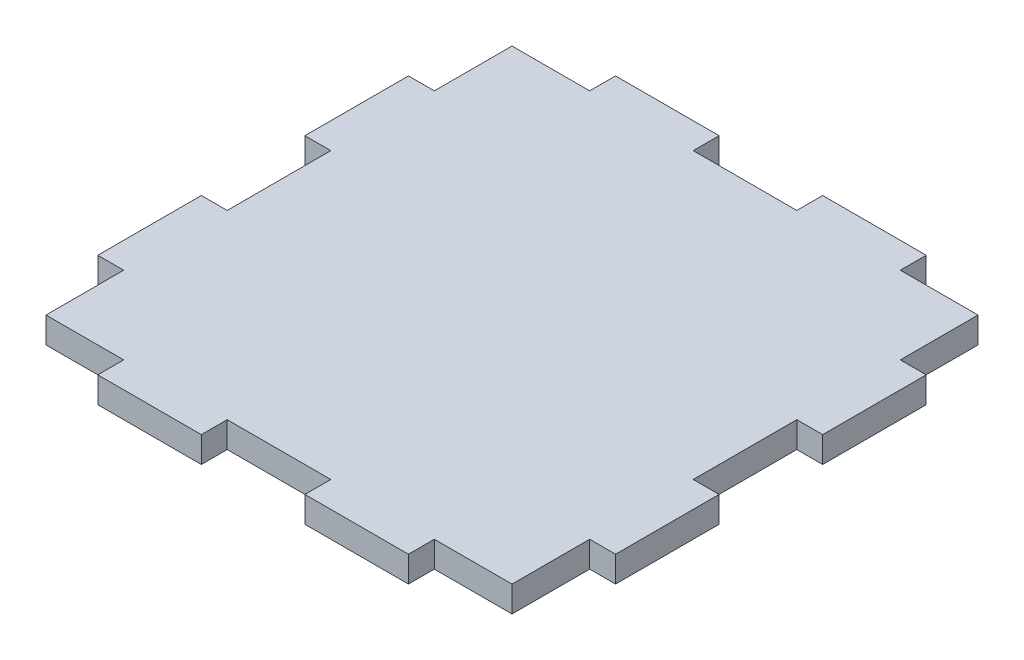
ISO-10303-21;
HEADER;
FILE_DESCRIPTION(('STEP AP214'),'2;1');
FILE_NAME('part.step','',(''),(''),'','','');
FILE_SCHEMA(('AUTOMOTIVE_DESIGN { 1 0 10303 214 1 1 1 1 }'));
ENDSEC;
DATA;
#1=APPLICATION_CONTEXT('core data for automotive mechanical design processes');
#2=APPLICATION_PROTOCOL_DEFINITION('international standard','automotive_design',2000,#1);
#3=PRODUCT_CONTEXT('',#1,'mechanical');
#4=PRODUCT('Part','Part','',(#3));
#5=PRODUCT_RELATED_PRODUCT_CATEGORY('part','',(#4));
#6=PRODUCT_DEFINITION_FORMATION('','',#4);
#7=PRODUCT_DEFINITION_CONTEXT('part definition',#1,'design');
#8=PRODUCT_DEFINITION('design','',#6,#7);
#9=PRODUCT_DEFINITION_SHAPE('','',#8);
#10=(LENGTH_UNIT() NAMED_UNIT(*) SI_UNIT(.MILLI.,.METRE.));
#11=(NAMED_UNIT(*) PLANE_ANGLE_UNIT() SI_UNIT($,.RADIAN.));
#12=(NAMED_UNIT(*) SI_UNIT($,.STERADIAN.) SOLID_ANGLE_UNIT());
#13=UNCERTAINTY_MEASURE_WITH_UNIT(LENGTH_MEASURE(1.E-05),#10,'distance_accuracy_value','');
#14=(GEOMETRIC_REPRESENTATION_CONTEXT(3) GLOBAL_UNCERTAINTY_ASSIGNED_CONTEXT((#13)) GLOBAL_UNIT_ASSIGNED_CONTEXT((#10,
#11,#12)) REPRESENTATION_CONTEXT('',''));
#15=CARTESIAN_POINT('',(0.,0.,0.));
#16=DIRECTION('',(0.,0.,1.));
#17=DIRECTION('',(1.,0.,0.));
#18=AXIS2_PLACEMENT_3D('',#15,#16,#17);
#19=CARTESIAN_POINT('',(-186.27216066482,9.525,3.17867036011081));
#20=DIRECTION('',(0.,0.,-1.));
#21=DIRECTION('',(-1.,0.,0.));
#22=AXIS2_PLACEMENT_3D('',#19,#20,#21);
#23=PLANE('',#22);
#24=DIRECTION('',(1.,0.,0.));
#25=VECTOR('',#24,1.);
#26=CARTESIAN_POINT('',(-186.27216066482,0.,3.17867036011081));
#27=LINE('',#26,#25);
#28=CARTESIAN_POINT('',(-148.17216066482,0.,3.17867036011081));
#29=VERTEX_POINT('',#28);
#30=CARTESIAN_POINT('',(-110.07216066482,0.,3.17867036011081));
#31=VERTEX_POINT('',#30);
#32=EDGE_CURVE('E631',#29,#31,#27,.T.);
#33=ORIENTED_EDGE('',*,*,#32,.T.);
#34=DIRECTION('',(0.,-1.,0.));
#35=VECTOR('',#34,1.);
#36=CARTESIAN_POINT('',(-110.07216066482,9.525,3.17867036011081));
#37=LINE('',#36,#35);
#38=CARTESIAN_POINT('',(-110.07216066482,9.525,3.17867036011081));
#39=VERTEX_POINT('',#38);
#40=EDGE_CURVE('E331',#39,#31,#37,.T.);
#41=ORIENTED_EDGE('',*,*,#40,.F.);
#42=DIRECTION('',(1.,0.,0.));
#43=VECTOR('',#42,1.);
#44=CARTESIAN_POINT('',(-186.27216066482,9.525,3.17867036011081));
#45=LINE('',#44,#43);
#46=CARTESIAN_POINT('',(-148.17216066482,9.525,3.17867036011081));
#47=VERTEX_POINT('',#46);
#48=EDGE_CURVE('E618',#47,#39,#45,.T.);
#49=ORIENTED_EDGE('',*,*,#48,.F.);
#50=DIRECTION('',(0.,-1.,0.));
#51=VECTOR('',#50,1.);
#52=CARTESIAN_POINT('',(-148.17216066482,9.525,3.17867036011081));
#53=LINE('',#52,#51);
#54=EDGE_CURVE('E359',#47,#29,#53,.T.);
#55=ORIENTED_EDGE('',*,*,#54,.T.);
#56=EDGE_LOOP('',(#33,#41,#49,#55));
#57=FACE_BOUND('',#56,.T.);
#58=ADVANCED_FACE('F39',(#57),#23,.F.);
#59=CARTESIAN_POINT('',(-186.27216066482,9.525,-187.321329639889));
#60=DIRECTION('',(0.,0.,1.));
#61=DIRECTION('',(1.,0.,0.));
#62=AXIS2_PLACEMENT_3D('',#59,#60,#61);
#63=PLANE('',#62);
#64=DIRECTION('',(-1.,0.,0.));
#65=VECTOR('',#64,1.);
#66=CARTESIAN_POINT('',(-186.27216066482,0.,-187.321329639889));
#67=LINE('',#66,#65);
#68=CARTESIAN_POINT('',(-33.8721606648199,0.,-187.321329639889));
#69=VERTEX_POINT('',#68);
#70=CARTESIAN_POINT('',(-71.97216066482,0.,-187.321329639889));
#71=VERTEX_POINT('',#70);
#72=EDGE_CURVE('E43',#69,#71,#67,.T.);
#73=ORIENTED_EDGE('',*,*,#72,.T.);
#74=DIRECTION('',(0.,-1.,0.));
#75=VECTOR('',#74,1.);
#76=CARTESIAN_POINT('',(-71.97216066482,9.525,-187.321329639889));
#77=LINE('',#76,#75);
#78=CARTESIAN_POINT('',(-71.97216066482,9.525,-187.321329639889));
#79=VERTEX_POINT('',#78);
#80=EDGE_CURVE('E416',#79,#71,#77,.T.);
#81=ORIENTED_EDGE('',*,*,#80,.F.);
#82=DIRECTION('',(-1.,0.,0.));
#83=VECTOR('',#82,1.);
#84=CARTESIAN_POINT('',(-186.27216066482,9.525,-187.321329639889));
#85=LINE('',#84,#83);
#86=CARTESIAN_POINT('',(-33.8721606648199,9.525,-187.321329639889));
#87=VERTEX_POINT('',#86);
#88=EDGE_CURVE('E11',#87,#79,#85,.T.);
#89=ORIENTED_EDGE('',*,*,#88,.F.);
#90=DIRECTION('',(0.,-1.,0.));
#91=VECTOR('',#90,1.);
#92=CARTESIAN_POINT('',(-33.8721606648199,9.525,-187.321329639889));
#93=LINE('',#92,#91);
#94=EDGE_CURVE('E445',#87,#69,#93,.T.);
#95=ORIENTED_EDGE('',*,*,#94,.T.);
#96=EDGE_LOOP('',(#73,#81,#89,#95));
#97=FACE_BOUND('',#96,.T.);
#98=ADVANCED_FACE('F676',(#97),#63,.F.);
#99=CARTESIAN_POINT('',(-186.27216066482,9.525,-187.321329639889));
#100=DIRECTION('',(1.,0.,0.));
#101=DIRECTION('',(0.,0.,-1.));
#102=AXIS2_PLACEMENT_3D('',#99,#100,#101);
#103=PLANE('',#102);
#104=DIRECTION('',(0.,0.,1.));
#105=VECTOR('',#104,1.);
#106=CARTESIAN_POINT('',(-186.27216066482,9.525,-187.321329639889));
#107=LINE('',#106,#105);
#108=CARTESIAN_POINT('',(-186.27216066482,9.525,-73.0213296398892));
#109=VERTEX_POINT('',#108);
#110=CARTESIAN_POINT('',(-186.27216066482,9.525,-34.9213296398892));
#111=VERTEX_POINT('',#110);
#112=EDGE_CURVE('E617',#109,#111,#107,.T.);
#113=ORIENTED_EDGE('',*,*,#112,.F.);
#114=DIRECTION('',(0.,-1.,0.));
#115=VECTOR('',#114,1.);
#116=CARTESIAN_POINT('',(-186.27216066482,9.525,-73.0213296398892));
#117=LINE('',#116,#115);
#118=CARTESIAN_POINT('',(-186.27216066482,0.,-73.0213296398892));
#119=VERTEX_POINT('',#118);
#120=EDGE_CURVE('E499',#109,#119,#117,.T.);
#121=ORIENTED_EDGE('',*,*,#120,.T.);
#122=DIRECTION('',(0.,0.,1.));
#123=VECTOR('',#122,1.);
#124=CARTESIAN_POINT('',(-186.27216066482,0.,-187.321329639889));
#125=LINE('',#124,#123);
#126=CARTESIAN_POINT('',(-186.27216066482,0.,-34.9213296398892));
#127=VERTEX_POINT('',#126);
#128=EDGE_CURVE('E611',#119,#127,#125,.T.);
#129=ORIENTED_EDGE('',*,*,#128,.T.);
#130=DIRECTION('',(0.,-1.,0.));
#131=VECTOR('',#130,1.);
#132=CARTESIAN_POINT('',(-186.27216066482,9.525,-34.9213296398892));
#133=LINE('',#132,#131);
#134=EDGE_CURVE('E522',#111,#127,#133,.T.);
#135=ORIENTED_EDGE('',*,*,#134,.F.);
#136=EDGE_LOOP('',(#113,#121,#129,#135));
#137=FACE_BOUND('',#136,.T.);
#138=ADVANCED_FACE('F710',(#137),#103,.F.);
#139=CARTESIAN_POINT('',(4.22783933518003,9.525,-187.321329639889));
#140=DIRECTION('',(-1.,0.,0.));
#141=DIRECTION('',(0.,0.,1.));
#142=AXIS2_PLACEMENT_3D('',#139,#140,#141);
#143=PLANE('',#142);
#144=DIRECTION('',(0.,0.,-1.));
#145=VECTOR('',#144,1.);
#146=CARTESIAN_POINT('',(4.22783933518003,0.,-187.321329639889));
#147=LINE('',#146,#145);
#148=CARTESIAN_POINT('',(4.22783933518006,0.,-34.9213296398892));
#149=VERTEX_POINT('',#148);
#150=CARTESIAN_POINT('',(4.22783933518005,0.,-73.0213296398892));
#151=VERTEX_POINT('',#150);
#152=EDGE_CURVE('E635',#149,#151,#147,.T.);
#153=ORIENTED_EDGE('',*,*,#152,.T.);
#154=DIRECTION('',(0.,1.,0.));
#155=VECTOR('',#154,1.);
#156=CARTESIAN_POINT('',(4.22783933518005,0.,-73.0213296398892));
#157=LINE('',#156,#155);
#158=CARTESIAN_POINT('',(4.22783933518005,9.525,-73.0213296398892));
#159=VERTEX_POINT('',#158);
#160=EDGE_CURVE('E580',#151,#159,#157,.T.);
#161=ORIENTED_EDGE('',*,*,#160,.T.);
#162=DIRECTION('',(0.,0.,-1.));
#163=VECTOR('',#162,1.);
#164=CARTESIAN_POINT('',(4.22783933518003,9.525,-187.321329639889));
#165=LINE('',#164,#163);
#166=CARTESIAN_POINT('',(4.22783933518006,9.525,-34.9213296398892));
#167=VERTEX_POINT('',#166);
#168=EDGE_CURVE('E623',#167,#159,#165,.T.);
#169=ORIENTED_EDGE('',*,*,#168,.F.);
#170=DIRECTION('',(0.,1.,0.));
#171=VECTOR('',#170,1.);
#172=CARTESIAN_POINT('',(4.22783933518006,0.,-34.9213296398892));
#173=LINE('',#172,#171);
#174=EDGE_CURVE('E602',#149,#167,#173,.T.);
#175=ORIENTED_EDGE('',*,*,#174,.F.);
#176=EDGE_LOOP('',(#153,#161,#169,#175));
#177=FACE_BOUND('',#176,.T.);
#178=ADVANCED_FACE('F720',(#177),#143,.F.);
#179=CARTESIAN_POINT('',(-186.27216066482,9.525,-149.221329639889));
#180=VERTEX_POINT('',#179);
#181=CARTESIAN_POINT('',(-186.27216066482,9.525,-111.121329639889));
#182=VERTEX_POINT('',#181);
#183=EDGE_CURVE('E614',#180,#182,#107,.T.);
#184=ORIENTED_EDGE('',*,*,#183,.F.);
#185=DIRECTION('',(0.,-1.,0.));
#186=VECTOR('',#185,1.);
#187=CARTESIAN_POINT('',(-186.27216066482,9.525,-149.221329639889));
#188=LINE('',#187,#186);
#189=CARTESIAN_POINT('',(-186.27216066482,0.,-149.221329639889));
#190=VERTEX_POINT('',#189);
#191=EDGE_CURVE('E468',#180,#190,#188,.T.);
#192=ORIENTED_EDGE('',*,*,#191,.T.);
#193=CARTESIAN_POINT('',(-186.27216066482,0.,-111.121329639889));
#194=VERTEX_POINT('',#193);
#195=EDGE_CURVE('E627',#190,#194,#125,.T.);
#196=ORIENTED_EDGE('',*,*,#195,.T.);
#197=DIRECTION('',(0.,-1.,0.));
#198=VECTOR('',#197,1.);
#199=CARTESIAN_POINT('',(-186.27216066482,9.525,-111.121329639889));
#200=LINE('',#199,#198);
#201=EDGE_CURVE('E489',#182,#194,#200,.T.);
#202=ORIENTED_EDGE('',*,*,#201,.F.);
#203=EDGE_LOOP('',(#184,#192,#196,#202));
#204=FACE_BOUND('',#203,.T.);
#205=ADVANCED_FACE('F41',(#204),#103,.F.);
#206=CARTESIAN_POINT('',(-71.97216066482,0.,3.17867036011081));
#207=VERTEX_POINT('',#206);
#208=CARTESIAN_POINT('',(-33.87216066482,0.,3.17867036011081));
#209=VERTEX_POINT('',#208);
#210=EDGE_CURVE('E630',#207,#209,#27,.T.);
#211=ORIENTED_EDGE('',*,*,#210,.T.);
#212=DIRECTION('',(0.,-1.,0.));
#213=VECTOR('',#212,1.);
#214=CARTESIAN_POINT('',(-33.87216066482,9.525,3.17867036011081));
#215=LINE('',#214,#213);
#216=CARTESIAN_POINT('',(-33.87216066482,9.525,3.17867036011081));
#217=VERTEX_POINT('',#216);
#218=EDGE_CURVE('E305',#217,#209,#215,.T.);
#219=ORIENTED_EDGE('',*,*,#218,.F.);
#220=CARTESIAN_POINT('',(-71.97216066482,9.525,3.17867036011081));
#221=VERTEX_POINT('',#220);
#222=EDGE_CURVE('E297',#221,#217,#45,.T.);
#223=ORIENTED_EDGE('',*,*,#222,.F.);
#224=DIRECTION('',(0.,-1.,0.));
#225=VECTOR('',#224,1.);
#226=CARTESIAN_POINT('',(-71.97216066482,9.525,3.17867036011081));
#227=LINE('',#226,#225);
#228=EDGE_CURVE('E335',#221,#207,#227,.T.);
#229=ORIENTED_EDGE('',*,*,#228,.T.);
#230=EDGE_LOOP('',(#211,#219,#223,#229));
#231=FACE_BOUND('',#230,.T.);
#232=ADVANCED_FACE('F706',(#231),#23,.F.);
#233=CARTESIAN_POINT('',(4.22783933518006,0.,-111.121329639889));
#234=VERTEX_POINT('',#233);
#235=CARTESIAN_POINT('',(4.22783933518006,0.,-149.221329639889));
#236=VERTEX_POINT('',#235);
#237=EDGE_CURVE('E634',#234,#236,#147,.T.);
#238=ORIENTED_EDGE('',*,*,#237,.T.);
#239=DIRECTION('',(0.,1.,0.));
#240=VECTOR('',#239,1.);
#241=CARTESIAN_POINT('',(4.22783933518006,0.,-149.221329639889));
#242=LINE('',#241,#240);
#243=CARTESIAN_POINT('',(4.22783933518006,9.525,-149.221329639889));
#244=VERTEX_POINT('',#243);
#245=EDGE_CURVE('E549',#236,#244,#242,.T.);
#246=ORIENTED_EDGE('',*,*,#245,.T.);
#247=CARTESIAN_POINT('',(4.22783933518006,9.525,-111.121329639889));
#248=VERTEX_POINT('',#247);
#249=EDGE_CURVE('E622',#248,#244,#165,.T.);
#250=ORIENTED_EDGE('',*,*,#249,.F.);
#251=DIRECTION('',(0.,1.,0.));
#252=VECTOR('',#251,1.);
#253=CARTESIAN_POINT('',(4.22783933518006,0.,-111.121329639889));
#254=LINE('',#253,#252);
#255=EDGE_CURVE('E570',#234,#248,#254,.T.);
#256=ORIENTED_EDGE('',*,*,#255,.F.);
#257=EDGE_LOOP('',(#238,#246,#250,#256));
#258=FACE_BOUND('',#257,.T.);
#259=ADVANCED_FACE('F649',(#258),#143,.F.);
#260=CARTESIAN_POINT('',(-110.07216066482,0.,-187.321329639889));
#261=VERTEX_POINT('',#260);
#262=CARTESIAN_POINT('',(-148.17216066482,0.,-187.321329639889));
#263=VERTEX_POINT('',#262);
#264=EDGE_CURVE('E638',#261,#263,#67,.T.);
#265=ORIENTED_EDGE('',*,*,#264,.T.);
#266=DIRECTION('',(0.,-1.,0.));
#267=VECTOR('',#266,1.);
#268=CARTESIAN_POINT('',(-148.17216066482,9.525,-187.321329639889));
#269=LINE('',#268,#267);
#270=CARTESIAN_POINT('',(-148.17216066482,9.525,-187.321329639889));
#271=VERTEX_POINT('',#270);
#272=EDGE_CURVE('E384',#271,#263,#269,.T.);
#273=ORIENTED_EDGE('',*,*,#272,.F.);
#274=CARTESIAN_POINT('',(-110.07216066482,9.525,-187.321329639889));
#275=VERTEX_POINT('',#274);
#276=EDGE_CURVE('E49',#275,#271,#85,.T.);
#277=ORIENTED_EDGE('',*,*,#276,.F.);
#278=DIRECTION('',(0.,-1.,0.));
#279=VECTOR('',#278,1.);
#280=CARTESIAN_POINT('',(-110.07216066482,9.525,-187.321329639889));
#281=LINE('',#280,#279);
#282=EDGE_CURVE('E420',#275,#261,#281,.T.);
#283=ORIENTED_EDGE('',*,*,#282,.T.);
#284=EDGE_LOOP('',(#265,#273,#277,#283));
#285=FACE_BOUND('',#284,.T.);
#286=ADVANCED_FACE('F712',(#285),#63,.F.);
#287=CARTESIAN_POINT('',(0.,9.525,0.));
#288=DIRECTION('',(0.,1.,0.));
#289=DIRECTION('',(0.,0.,1.));
#290=AXIS2_PLACEMENT_3D('',#287,#288,#289);
#291=PLANE('',#290);
#292=DIRECTION('',(0.,0.,-1.));
#293=VECTOR('',#292,1.);
#294=CARTESIAN_POINT('',(-33.87216066482,9.525,3.17867036011081));
#295=LINE('',#294,#293);
#296=CARTESIAN_POINT('',(-33.87216066482,9.525,-6.34632963988919));
#297=VERTEX_POINT('',#296);
#298=EDGE_CURVE('E278',#217,#297,#295,.T.);
#299=ORIENTED_EDGE('',*,*,#298,.T.);
#300=DIRECTION('',(1.,0.,0.));
#301=VECTOR('',#300,1.);
#302=CARTESIAN_POINT('',(-33.87216066482,9.525,-6.34632963988919));
#303=LINE('',#302,#301);
#304=CARTESIAN_POINT('',(-5.29716066481994,9.525,-6.34632963988919));
#305=VERTEX_POINT('',#304);
#306=EDGE_CURVE('E284',#297,#305,#303,.T.);
#307=ORIENTED_EDGE('',*,*,#306,.T.);
#308=DIRECTION('',(0.,0.,1.));
#309=VECTOR('',#308,1.);
#310=CARTESIAN_POINT('',(-5.29716066481994,9.525,3.1786703601108));
#311=LINE('',#310,#309);
#312=CARTESIAN_POINT('',(-5.29716066481994,9.525,-34.9213296398892));
#313=VERTEX_POINT('',#312);
#314=EDGE_CURVE('E584',#313,#305,#311,.T.);
#315=ORIENTED_EDGE('',*,*,#314,.F.);
#316=DIRECTION('',(-1.,0.,0.));
#317=VECTOR('',#316,1.);
#318=CARTESIAN_POINT('',(-5.29716066481994,9.525,-34.9213296398892));
#319=LINE('',#318,#317);
#320=EDGE_CURVE('E598',#167,#313,#319,.T.);
#321=ORIENTED_EDGE('',*,*,#320,.F.);
#322=ORIENTED_EDGE('',*,*,#168,.T.);
#323=DIRECTION('',(1.,0.,0.));
#324=VECTOR('',#323,1.);
#325=CARTESIAN_POINT('',(4.22783933518005,9.525,-73.0213296398892));
#326=LINE('',#325,#324);
#327=CARTESIAN_POINT('',(-5.29716066481995,9.525,-73.0213296398892));
#328=VERTEX_POINT('',#327);
#329=EDGE_CURVE('E562',#328,#159,#326,.T.);
#330=ORIENTED_EDGE('',*,*,#329,.F.);
#331=DIRECTION('',(0.,0.,1.));
#332=VECTOR('',#331,1.);
#333=CARTESIAN_POINT('',(-5.29716066481995,9.525,-73.0213296398892));
#334=LINE('',#333,#332);
#335=CARTESIAN_POINT('',(-5.29716066481995,9.525,-111.121329639889));
#336=VERTEX_POINT('',#335);
#337=EDGE_CURVE('E574',#336,#328,#334,.T.);
#338=ORIENTED_EDGE('',*,*,#337,.F.);
#339=DIRECTION('',(-1.,0.,0.));
#340=VECTOR('',#339,1.);
#341=CARTESIAN_POINT('',(4.22783933518006,9.525,-111.121329639889));
#342=LINE('',#341,#340);
#343=EDGE_CURVE('E553',#248,#336,#342,.T.);
#344=ORIENTED_EDGE('',*,*,#343,.F.);
#345=ORIENTED_EDGE('',*,*,#249,.T.);
#346=DIRECTION('',(1.,0.,0.));
#347=VECTOR('',#346,1.);
#348=CARTESIAN_POINT('',(4.22783933518006,9.525,-149.221329639889));
#349=LINE('',#348,#347);
#350=CARTESIAN_POINT('',(-5.29716066481994,9.525,-149.221329639889));
#351=VERTEX_POINT('',#350);
#352=EDGE_CURVE('E540',#351,#244,#349,.T.);
#353=ORIENTED_EDGE('',*,*,#352,.F.);
#354=DIRECTION('',(0.,0.,1.));
#355=VECTOR('',#354,1.);
#356=CARTESIAN_POINT('',(-5.29716066481994,9.525,-149.221329639889));
#357=LINE('',#356,#355);
#358=CARTESIAN_POINT('',(-5.29716066481994,9.525,-177.796329639889));
#359=VERTEX_POINT('',#358);
#360=EDGE_CURVE('E532',#359,#351,#357,.T.);
#361=ORIENTED_EDGE('',*,*,#360,.F.);
#362=DIRECTION('',(-1.,0.,0.));
#363=VECTOR('',#362,1.);
#364=CARTESIAN_POINT('',(-5.29716066481995,9.525,-177.796329639889));
#365=LINE('',#364,#363);
#366=CARTESIAN_POINT('',(-33.8721606648199,9.525,-177.796329639889));
#367=VERTEX_POINT('',#366);
#368=EDGE_CURVE('E430',#359,#367,#365,.T.);
#369=ORIENTED_EDGE('',*,*,#368,.T.);
#370=DIRECTION('',(0.,0.,-1.));
#371=VECTOR('',#370,1.);
#372=CARTESIAN_POINT('',(-33.8721606648199,9.525,-177.796329639889));
#373=LINE('',#372,#371);
#374=EDGE_CURVE('E434',#367,#87,#373,.T.);
#375=ORIENTED_EDGE('',*,*,#374,.T.);
#376=ORIENTED_EDGE('',*,*,#88,.T.);
#377=DIRECTION('',(0.,0.,1.));
#378=VECTOR('',#377,1.);
#379=CARTESIAN_POINT('',(-71.97216066482,9.525,-187.321329639889));
#380=LINE('',#379,#378);
#381=CARTESIAN_POINT('',(-71.97216066482,9.525,-177.796329639889));
#382=VERTEX_POINT('',#381);
#383=EDGE_CURVE('E394',#79,#382,#380,.T.);
#384=ORIENTED_EDGE('',*,*,#383,.T.);
#385=DIRECTION('',(-1.,0.,0.));
#386=VECTOR('',#385,1.);
#387=CARTESIAN_POINT('',(-71.97216066482,9.525,-177.796329639889));
#388=LINE('',#387,#386);
#389=CARTESIAN_POINT('',(-110.07216066482,9.525,-177.796329639889));
#390=VERTEX_POINT('',#389);
#391=EDGE_CURVE('E398',#382,#390,#388,.T.);
#392=ORIENTED_EDGE('',*,*,#391,.T.);
#393=DIRECTION('',(0.,0.,-1.));
#394=VECTOR('',#393,1.);
#395=CARTESIAN_POINT('',(-110.07216066482,9.525,-187.321329639889));
#396=LINE('',#395,#394);
#397=EDGE_CURVE('E403',#390,#275,#396,.T.);
#398=ORIENTED_EDGE('',*,*,#397,.T.);
#399=ORIENTED_EDGE('',*,*,#276,.T.);
#400=DIRECTION('',(0.,0.,1.));
#401=VECTOR('',#400,1.);
#402=CARTESIAN_POINT('',(-148.17216066482,9.525,-187.321329639889));
#403=LINE('',#402,#401);
#404=CARTESIAN_POINT('',(-148.17216066482,9.525,-177.796329639889));
#405=VERTEX_POINT('',#404);
#406=EDGE_CURVE('E369',#271,#405,#403,.T.);
#407=ORIENTED_EDGE('',*,*,#406,.T.);
#408=DIRECTION('',(-1.,0.,0.));
#409=VECTOR('',#408,1.);
#410=CARTESIAN_POINT('',(-148.17216066482,9.525,-177.796329639889));
#411=LINE('',#410,#409);
#412=CARTESIAN_POINT('',(-176.74716066482,9.525,-177.796329639889));
#413=VERTEX_POINT('',#412);
#414=EDGE_CURVE('E373',#405,#413,#411,.T.);
#415=ORIENTED_EDGE('',*,*,#414,.T.);
#416=DIRECTION('',(0.,0.,1.));
#417=VECTOR('',#416,1.);
#418=CARTESIAN_POINT('',(-176.74716066482,9.525,-149.221329639889));
#419=LINE('',#418,#417);
#420=CARTESIAN_POINT('',(-176.74716066482,9.525,-149.221329639889));
#421=VERTEX_POINT('',#420);
#422=EDGE_CURVE('E455',#413,#421,#419,.T.);
#423=ORIENTED_EDGE('',*,*,#422,.T.);
#424=DIRECTION('',(-1.,0.,0.));
#425=VECTOR('',#424,1.);
#426=CARTESIAN_POINT('',(-186.27216066482,9.525,-149.221329639889));
#427=LINE('',#426,#425);
#428=EDGE_CURVE('E458',#421,#180,#427,.T.);
#429=ORIENTED_EDGE('',*,*,#428,.T.);
#430=ORIENTED_EDGE('',*,*,#183,.T.);
#431=DIRECTION('',(1.,0.,0.));
#432=VECTOR('',#431,1.);
#433=CARTESIAN_POINT('',(-186.27216066482,9.525,-111.121329639889));
#434=LINE('',#433,#432);
#435=CARTESIAN_POINT('',(-176.74716066482,9.525,-111.121329639889));
#436=VERTEX_POINT('',#435);
#437=EDGE_CURVE('E476',#182,#436,#434,.T.);
#438=ORIENTED_EDGE('',*,*,#437,.T.);
#439=DIRECTION('',(0.,0.,1.));
#440=VECTOR('',#439,1.);
#441=CARTESIAN_POINT('',(-176.74716066482,9.525,-73.0213296398892));
#442=LINE('',#441,#440);
#443=CARTESIAN_POINT('',(-176.74716066482,9.525,-73.0213296398892));
#444=VERTEX_POINT('',#443);
#445=EDGE_CURVE('E480',#436,#444,#442,.T.);
#446=ORIENTED_EDGE('',*,*,#445,.T.);
#447=DIRECTION('',(-1.,0.,0.));
#448=VECTOR('',#447,1.);
#449=CARTESIAN_POINT('',(-186.27216066482,9.525,-73.0213296398892));
#450=LINE('',#449,#448);
#451=EDGE_CURVE('E485',#444,#109,#450,.T.);
#452=ORIENTED_EDGE('',*,*,#451,.T.);
#453=ORIENTED_EDGE('',*,*,#112,.T.);
#454=DIRECTION('',(1.,0.,0.));
#455=VECTOR('',#454,1.);
#456=CARTESIAN_POINT('',(-176.74716066482,9.525,-34.9213296398892));
#457=LINE('',#456,#455);
#458=CARTESIAN_POINT('',(-176.74716066482,9.525,-34.9213296398892));
#459=VERTEX_POINT('',#458);
#460=EDGE_CURVE('E517',#111,#459,#457,.T.);
#461=ORIENTED_EDGE('',*,*,#460,.T.);
#462=DIRECTION('',(0.,0.,1.));
#463=VECTOR('',#462,1.);
#464=CARTESIAN_POINT('',(-176.74716066482,9.525,3.17867036011081));
#465=LINE('',#464,#463);
#466=CARTESIAN_POINT('',(-176.74716066482,9.525,-6.3463296398892));
#467=VERTEX_POINT('',#466);
#468=EDGE_CURVE('E513',#459,#467,#465,.T.);
#469=ORIENTED_EDGE('',*,*,#468,.T.);
#470=DIRECTION('',(1.,0.,0.));
#471=VECTOR('',#470,1.);
#472=CARTESIAN_POINT('',(-176.74716066482,9.525,-6.3463296398892));
#473=LINE('',#472,#471);
#474=CARTESIAN_POINT('',(-148.17216066482,9.525,-6.3463296398892));
#475=VERTEX_POINT('',#474);
#476=EDGE_CURVE('E344',#467,#475,#473,.T.);
#477=ORIENTED_EDGE('',*,*,#476,.T.);
#478=DIRECTION('',(0.,0.,1.));
#479=VECTOR('',#478,1.);
#480=CARTESIAN_POINT('',(-148.17216066482,9.525,-6.3463296398892));
#481=LINE('',#480,#479);
#482=EDGE_CURVE('E348',#475,#47,#481,.T.);
#483=ORIENTED_EDGE('',*,*,#482,.T.);
#484=ORIENTED_EDGE('',*,*,#48,.T.);
#485=DIRECTION('',(0.,0.,-1.));
#486=VECTOR('',#485,1.);
#487=CARTESIAN_POINT('',(-110.07216066482,9.525,3.17867036011081));
#488=LINE('',#487,#486);
#489=CARTESIAN_POINT('',(-110.07216066482,9.525,-6.34632963988919));
#490=VERTEX_POINT('',#489);
#491=EDGE_CURVE('E310',#39,#490,#488,.T.);
#492=ORIENTED_EDGE('',*,*,#491,.T.);
#493=DIRECTION('',(1.,0.,0.));
#494=VECTOR('',#493,1.);
#495=CARTESIAN_POINT('',(-110.07216066482,9.525,-6.34632963988919));
#496=LINE('',#495,#494);
#497=CARTESIAN_POINT('',(-71.97216066482,9.525,-6.34632963988919));
#498=VERTEX_POINT('',#497);
#499=EDGE_CURVE('E314',#490,#498,#496,.T.);
#500=ORIENTED_EDGE('',*,*,#499,.T.);
#501=DIRECTION('',(0.,0.,1.));
#502=VECTOR('',#501,1.);
#503=CARTESIAN_POINT('',(-71.97216066482,9.525,3.17867036011081));
#504=LINE('',#503,#502);
#505=EDGE_CURVE('E319',#498,#221,#504,.T.);
#506=ORIENTED_EDGE('',*,*,#505,.T.);
#507=ORIENTED_EDGE('',*,*,#222,.T.);
#508=EDGE_LOOP('',(#299,#307,#315,#321,#322,#330,#338,#344,#345,#353,#361,#369,#375,#376,#384,
#392,#398,#399,#407,#415,#423,#429,#430,#438,#446,#452,#453,#461,#469,#477,#483,#484,#492,#500,
#506,#507));
#509=FACE_BOUND('',#508,.T.);
#510=ADVANCED_FACE('F294',(#509),#291,.T.);
#511=CARTESIAN_POINT('',(0.,0.,0.));
#512=DIRECTION('',(0.,1.,0.));
#513=DIRECTION('',(0.,0.,1.));
#514=AXIS2_PLACEMENT_3D('',#511,#512,#513);
#515=PLANE('',#514);
#516=DIRECTION('',(1.,0.,0.));
#517=VECTOR('',#516,1.);
#518=CARTESIAN_POINT('',(-33.87216066482,0.,-6.34632963988919));
#519=LINE('',#518,#517);
#520=CARTESIAN_POINT('',(-33.87216066482,0.,-6.34632963988919));
#521=VERTEX_POINT('',#520);
#522=CARTESIAN_POINT('',(-5.29716066481994,0.,-6.34632963988919));
#523=VERTEX_POINT('',#522);
#524=EDGE_CURVE('E57',#521,#523,#519,.T.);
#525=ORIENTED_EDGE('',*,*,#524,.F.);
#526=DIRECTION('',(0.,0.,-1.));
#527=VECTOR('',#526,1.);
#528=CARTESIAN_POINT('',(-33.87216066482,0.,3.17867036011081));
#529=LINE('',#528,#527);
#530=EDGE_CURVE('E281',#209,#521,#529,.T.);
#531=ORIENTED_EDGE('',*,*,#530,.F.);
#532=ORIENTED_EDGE('',*,*,#210,.F.);
#533=DIRECTION('',(0.,0.,1.));
#534=VECTOR('',#533,1.);
#535=CARTESIAN_POINT('',(-71.97216066482,0.,3.17867036011081));
#536=LINE('',#535,#534);
#537=CARTESIAN_POINT('',(-71.97216066482,0.,-6.34632963988919));
#538=VERTEX_POINT('',#537);
#539=EDGE_CURVE('E315',#538,#207,#536,.T.);
#540=ORIENTED_EDGE('',*,*,#539,.F.);
#541=DIRECTION('',(1.,0.,0.));
#542=VECTOR('',#541,1.);
#543=CARTESIAN_POINT('',(-110.07216066482,0.,-6.34632963988919));
#544=LINE('',#543,#542);
#545=CARTESIAN_POINT('',(-110.07216066482,0.,-6.34632963988919));
#546=VERTEX_POINT('',#545);
#547=EDGE_CURVE('E325',#546,#538,#544,.T.);
#548=ORIENTED_EDGE('',*,*,#547,.F.);
#549=DIRECTION('',(0.,0.,-1.));
#550=VECTOR('',#549,1.);
#551=CARTESIAN_POINT('',(-110.07216066482,0.,3.17867036011081));
#552=LINE('',#551,#550);
#553=EDGE_CURVE('E65',#31,#546,#552,.T.);
#554=ORIENTED_EDGE('',*,*,#553,.F.);
#555=ORIENTED_EDGE('',*,*,#32,.F.);
#556=DIRECTION('',(0.,0.,1.));
#557=VECTOR('',#556,1.);
#558=CARTESIAN_POINT('',(-148.17216066482,0.,-6.3463296398892));
#559=LINE('',#558,#557);
#560=CARTESIAN_POINT('',(-148.17216066482,0.,-6.3463296398892));
#561=VERTEX_POINT('',#560);
#562=EDGE_CURVE('E349',#561,#29,#559,.T.);
#563=ORIENTED_EDGE('',*,*,#562,.F.);
#564=DIRECTION('',(1.,0.,0.));
#565=VECTOR('',#564,1.);
#566=CARTESIAN_POINT('',(-176.74716066482,0.,-6.3463296398892));
#567=LINE('',#566,#565);
#568=CARTESIAN_POINT('',(-176.74716066482,0.,-6.3463296398892));
#569=VERTEX_POINT('',#568);
#570=EDGE_CURVE('E334',#569,#561,#567,.T.);
#571=ORIENTED_EDGE('',*,*,#570,.F.);
#572=DIRECTION('',(0.,0.,1.));
#573=VECTOR('',#572,1.);
#574=CARTESIAN_POINT('',(-176.74716066482,0.,3.17867036011081));
#575=LINE('',#574,#573);
#576=CARTESIAN_POINT('',(-176.74716066482,0.,-34.9213296398892));
#577=VERTEX_POINT('',#576);
#578=EDGE_CURVE('E503',#577,#569,#575,.T.);
#579=ORIENTED_EDGE('',*,*,#578,.F.);
#580=DIRECTION('',(1.,0.,0.));
#581=VECTOR('',#580,1.);
#582=CARTESIAN_POINT('',(-176.74716066482,0.,-34.9213296398892));
#583=LINE('',#582,#581);
#584=EDGE_CURVE('E518',#127,#577,#583,.T.);
#585=ORIENTED_EDGE('',*,*,#584,.F.);
#586=ORIENTED_EDGE('',*,*,#128,.F.);
#587=DIRECTION('',(-1.,0.,0.));
#588=VECTOR('',#587,1.);
#589=CARTESIAN_POINT('',(-186.27216066482,0.,-73.0213296398892));
#590=LINE('',#589,#588);
#591=CARTESIAN_POINT('',(-176.74716066482,0.,-73.0213296398892));
#592=VERTEX_POINT('',#591);
#593=EDGE_CURVE('E481',#592,#119,#590,.T.);
#594=ORIENTED_EDGE('',*,*,#593,.F.);
#595=DIRECTION('',(0.,0.,1.));
#596=VECTOR('',#595,1.);
#597=CARTESIAN_POINT('',(-176.74716066482,0.,-73.0213296398892));
#598=LINE('',#597,#596);
#599=CARTESIAN_POINT('',(-176.74716066482,0.,-111.121329639889));
#600=VERTEX_POINT('',#599);
#601=EDGE_CURVE('E493',#600,#592,#598,.T.);
#602=ORIENTED_EDGE('',*,*,#601,.F.);
#603=DIRECTION('',(1.,0.,0.));
#604=VECTOR('',#603,1.);
#605=CARTESIAN_POINT('',(-186.27216066482,0.,-111.121329639889));
#606=LINE('',#605,#604);
#607=EDGE_CURVE('E472',#194,#600,#606,.T.);
#608=ORIENTED_EDGE('',*,*,#607,.F.);
#609=ORIENTED_EDGE('',*,*,#195,.F.);
#610=DIRECTION('',(-1.,0.,0.));
#611=VECTOR('',#610,1.);
#612=CARTESIAN_POINT('',(-186.27216066482,0.,-149.221329639889));
#613=LINE('',#612,#611);
#614=CARTESIAN_POINT('',(-176.74716066482,0.,-149.221329639889));
#615=VERTEX_POINT('',#614);
#616=EDGE_CURVE('E459',#615,#190,#613,.T.);
#617=ORIENTED_EDGE('',*,*,#616,.F.);
#618=DIRECTION('',(0.,0.,1.));
#619=VECTOR('',#618,1.);
#620=CARTESIAN_POINT('',(-176.74716066482,0.,-149.221329639889));
#621=LINE('',#620,#619);
#622=CARTESIAN_POINT('',(-176.74716066482,0.,-177.796329639889));
#623=VERTEX_POINT('',#622);
#624=EDGE_CURVE('E449',#623,#615,#621,.T.);
#625=ORIENTED_EDGE('',*,*,#624,.F.);
#626=DIRECTION('',(-1.,0.,0.));
#627=VECTOR('',#626,1.);
#628=CARTESIAN_POINT('',(-148.17216066482,0.,-177.796329639889));
#629=LINE('',#628,#627);
#630=CARTESIAN_POINT('',(-148.17216066482,0.,-177.796329639889));
#631=VERTEX_POINT('',#630);
#632=EDGE_CURVE('E374',#631,#623,#629,.T.);
#633=ORIENTED_EDGE('',*,*,#632,.F.);
#634=DIRECTION('',(0.,0.,1.));
#635=VECTOR('',#634,1.);
#636=CARTESIAN_POINT('',(-148.17216066482,0.,-187.321329639889));
#637=LINE('',#636,#635);
#638=EDGE_CURVE('E363',#263,#631,#637,.T.);
#639=ORIENTED_EDGE('',*,*,#638,.F.);
#640=ORIENTED_EDGE('',*,*,#264,.F.);
#641=DIRECTION('',(0.,0.,-1.));
#642=VECTOR('',#641,1.);
#643=CARTESIAN_POINT('',(-110.07216066482,0.,-187.321329639889));
#644=LINE('',#643,#642);
#645=CARTESIAN_POINT('',(-110.07216066482,0.,-177.796329639889));
#646=VERTEX_POINT('',#645);
#647=EDGE_CURVE('E399',#646,#261,#644,.T.);
#648=ORIENTED_EDGE('',*,*,#647,.F.);
#649=DIRECTION('',(-1.,0.,0.));
#650=VECTOR('',#649,1.);
#651=CARTESIAN_POINT('',(-71.97216066482,0.,-177.796329639889));
#652=LINE('',#651,#650);
#653=CARTESIAN_POINT('',(-71.97216066482,0.,-177.796329639889));
#654=VERTEX_POINT('',#653);
#655=EDGE_CURVE('E410',#654,#646,#652,.T.);
#656=ORIENTED_EDGE('',*,*,#655,.F.);
#657=DIRECTION('',(0.,0.,1.));
#658=VECTOR('',#657,1.);
#659=CARTESIAN_POINT('',(-71.97216066482,0.,-187.321329639889));
#660=LINE('',#659,#658);
#661=EDGE_CURVE('E387',#71,#654,#660,.T.);
#662=ORIENTED_EDGE('',*,*,#661,.F.);
#663=ORIENTED_EDGE('',*,*,#72,.F.);
#664=DIRECTION('',(0.,0.,-1.));
#665=VECTOR('',#664,1.);
#666=CARTESIAN_POINT('',(-33.8721606648199,0.,-177.796329639889));
#667=LINE('',#666,#665);
#668=CARTESIAN_POINT('',(-33.8721606648199,0.,-177.796329639889));
#669=VERTEX_POINT('',#668);
#670=EDGE_CURVE('E435',#669,#69,#667,.T.);
#671=ORIENTED_EDGE('',*,*,#670,.F.);
#672=DIRECTION('',(-1.,0.,0.));
#673=VECTOR('',#672,1.);
#674=CARTESIAN_POINT('',(-5.29716066481995,0.,-177.796329639889));
#675=LINE('',#674,#673);
#676=CARTESIAN_POINT('',(-5.29716066481995,0.,-177.796329639889));
#677=VERTEX_POINT('',#676);
#678=EDGE_CURVE('E419',#677,#669,#675,.T.);
#679=ORIENTED_EDGE('',*,*,#678,.F.);
#680=DIRECTION('',(0.,0.,1.));
#681=VECTOR('',#680,1.);
#682=CARTESIAN_POINT('',(-5.29716066481994,0.,-149.221329639889));
#683=LINE('',#682,#681);
#684=CARTESIAN_POINT('',(-5.29716066481994,0.,-149.221329639889));
#685=VERTEX_POINT('',#684);
#686=EDGE_CURVE('E536',#677,#685,#683,.T.);
#687=ORIENTED_EDGE('',*,*,#686,.T.);
#688=DIRECTION('',(1.,0.,0.));
#689=VECTOR('',#688,1.);
#690=CARTESIAN_POINT('',(4.22783933518006,0.,-149.221329639889));
#691=LINE('',#690,#689);
#692=EDGE_CURVE('E539',#685,#236,#691,.T.);
#693=ORIENTED_EDGE('',*,*,#692,.T.);
#694=ORIENTED_EDGE('',*,*,#237,.F.);
#695=DIRECTION('',(-1.,0.,0.));
#696=VECTOR('',#695,1.);
#697=CARTESIAN_POINT('',(4.22783933518006,0.,-111.121329639889));
#698=LINE('',#697,#696);
#699=CARTESIAN_POINT('',(-5.29716066481995,0.,-111.121329639889));
#700=VERTEX_POINT('',#699);
#701=EDGE_CURVE('E557',#234,#700,#698,.T.);
#702=ORIENTED_EDGE('',*,*,#701,.T.);
#703=DIRECTION('',(0.,0.,1.));
#704=VECTOR('',#703,1.);
#705=CARTESIAN_POINT('',(-5.29716066481995,0.,-73.0213296398892));
#706=LINE('',#705,#704);
#707=CARTESIAN_POINT('',(-5.29716066481995,0.,-73.0213296398892));
#708=VERTEX_POINT('',#707);
#709=EDGE_CURVE('E561',#700,#708,#706,.T.);
#710=ORIENTED_EDGE('',*,*,#709,.T.);
#711=DIRECTION('',(1.,0.,0.));
#712=VECTOR('',#711,1.);
#713=CARTESIAN_POINT('',(4.22783933518005,0.,-73.0213296398892));
#714=LINE('',#713,#712);
#715=EDGE_CURVE('E566',#708,#151,#714,.T.);
#716=ORIENTED_EDGE('',*,*,#715,.T.);
#717=ORIENTED_EDGE('',*,*,#152,.F.);
#718=DIRECTION('',(-1.,0.,0.));
#719=VECTOR('',#718,1.);
#720=CARTESIAN_POINT('',(-5.29716066481994,0.,-34.9213296398892));
#721=LINE('',#720,#719);
#722=CARTESIAN_POINT('',(-5.29716066481994,0.,-34.9213296398892));
#723=VERTEX_POINT('',#722);
#724=EDGE_CURVE('E597',#149,#723,#721,.T.);
#725=ORIENTED_EDGE('',*,*,#724,.T.);
#726=DIRECTION('',(0.,0.,1.));
#727=VECTOR('',#726,1.);
#728=CARTESIAN_POINT('',(-5.29716066481994,0.,3.1786703601108));
#729=LINE('',#728,#727);
#730=EDGE_CURVE('E593',#723,#523,#729,.T.);
#731=ORIENTED_EDGE('',*,*,#730,.T.);
#732=EDGE_LOOP('',(#525,#531,#532,#540,#548,#554,#555,#563,#571,#579,#585,#586,#594,#602,#608,
#609,#617,#625,#633,#639,#640,#648,#656,#662,#663,#671,#679,#687,#693,#694,#702,#710,#716,#717,
#725,#731));
#733=FACE_BOUND('',#732,.T.);
#734=ADVANCED_FACE('F653',(#733),#515,.F.);
#735=CARTESIAN_POINT('',(-5.29716066481994,0.,3.1786703601108));
#736=DIRECTION('',(-1.,0.,0.));
#737=DIRECTION('',(0.,0.,1.));
#738=AXIS2_PLACEMENT_3D('',#735,#736,#737);
#739=PLANE('',#738);
#740=ORIENTED_EDGE('',*,*,#314,.T.);
#741=DIRECTION('',(0.,-1.,0.));
#742=VECTOR('',#741,1.);
#743=CARTESIAN_POINT('',(-5.29716066481994,9.525,-6.34632963988919));
#744=LINE('',#743,#742);
#745=EDGE_CURVE('E283',#305,#523,#744,.T.);
#746=ORIENTED_EDGE('',*,*,#745,.T.);
#747=ORIENTED_EDGE('',*,*,#730,.F.);
#748=DIRECTION('',(0.,1.,0.));
#749=VECTOR('',#748,1.);
#750=CARTESIAN_POINT('',(-5.29716066481994,0.,-34.9213296398892));
#751=LINE('',#750,#749);
#752=EDGE_CURVE('E608',#723,#313,#751,.T.);
#753=ORIENTED_EDGE('',*,*,#752,.T.);
#754=EDGE_LOOP('',(#740,#746,#747,#753));
#755=FACE_BOUND('',#754,.T.);
#756=ADVANCED_FACE('F1010',(#755),#739,.F.);
#757=CARTESIAN_POINT('',(-5.29716066481994,0.,-34.9213296398892));
#758=DIRECTION('',(0.,0.,-1.));
#759=DIRECTION('',(-1.,0.,0.));
#760=AXIS2_PLACEMENT_3D('',#757,#758,#759);
#761=PLANE('',#760);
#762=ORIENTED_EDGE('',*,*,#320,.T.);
#763=ORIENTED_EDGE('',*,*,#752,.F.);
#764=ORIENTED_EDGE('',*,*,#724,.F.);
#765=ORIENTED_EDGE('',*,*,#174,.T.);
#766=EDGE_LOOP('',(#762,#763,#764,#765));
#767=FACE_BOUND('',#766,.T.);
#768=ADVANCED_FACE('F999',(#767),#761,.F.);
#769=CARTESIAN_POINT('',(4.22783933518005,0.,-73.0213296398892));
#770=DIRECTION('',(0.,0.,1.));
#771=DIRECTION('',(1.,0.,0.));
#772=AXIS2_PLACEMENT_3D('',#769,#770,#771);
#773=PLANE('',#772);
#774=ORIENTED_EDGE('',*,*,#329,.T.);
#775=ORIENTED_EDGE('',*,*,#160,.F.);
#776=ORIENTED_EDGE('',*,*,#715,.F.);
#777=DIRECTION('',(0.,1.,0.));
#778=VECTOR('',#777,1.);
#779=CARTESIAN_POINT('',(-5.29716066481995,0.,-73.0213296398892));
#780=LINE('',#779,#778);
#781=EDGE_CURVE('E585',#708,#328,#780,.T.);
#782=ORIENTED_EDGE('',*,*,#781,.T.);
#783=EDGE_LOOP('',(#774,#775,#776,#782));
#784=FACE_BOUND('',#783,.T.);
#785=ADVANCED_FACE('F992',(#784),#773,.F.);
#786=CARTESIAN_POINT('',(-5.29716066481995,0.,-73.0213296398892));
#787=DIRECTION('',(-1.,0.,0.));
#788=DIRECTION('',(0.,0.,1.));
#789=AXIS2_PLACEMENT_3D('',#786,#787,#788);
#790=PLANE('',#789);
#791=ORIENTED_EDGE('',*,*,#337,.T.);
#792=ORIENTED_EDGE('',*,*,#781,.F.);
#793=ORIENTED_EDGE('',*,*,#709,.F.);
#794=DIRECTION('',(0.,1.,0.));
#795=VECTOR('',#794,1.);
#796=CARTESIAN_POINT('',(-5.29716066481995,0.,-111.121329639889));
#797=LINE('',#796,#795);
#798=EDGE_CURVE('E588',#700,#336,#797,.T.);
#799=ORIENTED_EDGE('',*,*,#798,.T.);
#800=EDGE_LOOP('',(#791,#792,#793,#799));
#801=FACE_BOUND('',#800,.T.);
#802=ADVANCED_FACE('F983',(#801),#790,.F.);
#803=CARTESIAN_POINT('',(4.22783933518006,0.,-111.121329639889));
#804=DIRECTION('',(0.,0.,-1.));
#805=DIRECTION('',(-1.,0.,0.));
#806=AXIS2_PLACEMENT_3D('',#803,#804,#805);
#807=PLANE('',#806);
#808=ORIENTED_EDGE('',*,*,#343,.T.);
#809=ORIENTED_EDGE('',*,*,#798,.F.);
#810=ORIENTED_EDGE('',*,*,#701,.F.);
#811=ORIENTED_EDGE('',*,*,#255,.T.);
#812=EDGE_LOOP('',(#808,#809,#810,#811));
#813=FACE_BOUND('',#812,.T.);
#814=ADVANCED_FACE('F974',(#813),#807,.F.);
#815=CARTESIAN_POINT('',(4.22783933518006,0.,-149.221329639889));
#816=DIRECTION('',(0.,0.,1.));
#817=DIRECTION('',(1.,0.,0.));
#818=AXIS2_PLACEMENT_3D('',#815,#816,#817);
#819=PLANE('',#818);
#820=ORIENTED_EDGE('',*,*,#352,.T.);
#821=ORIENTED_EDGE('',*,*,#245,.F.);
#822=ORIENTED_EDGE('',*,*,#692,.F.);
#823=DIRECTION('',(0.,1.,0.));
#824=VECTOR('',#823,1.);
#825=CARTESIAN_POINT('',(-5.29716066481994,0.,-149.221329639889));
#826=LINE('',#825,#824);
#827=EDGE_CURVE('E544',#685,#351,#826,.T.);
#828=ORIENTED_EDGE('',*,*,#827,.T.);
#829=EDGE_LOOP('',(#820,#821,#822,#828));
#830=FACE_BOUND('',#829,.T.);
#831=ADVANCED_FACE('F659',(#830),#819,.F.);
#832=CARTESIAN_POINT('',(-5.29716066481994,0.,-149.221329639889));
#833=DIRECTION('',(-1.,0.,0.));
#834=DIRECTION('',(0.,0.,1.));
#835=AXIS2_PLACEMENT_3D('',#832,#833,#834);
#836=PLANE('',#835);
#837=ORIENTED_EDGE('',*,*,#686,.F.);
#838=DIRECTION('',(0.,-1.,0.));
#839=VECTOR('',#838,1.);
#840=CARTESIAN_POINT('',(-5.29716066481995,9.525,-177.796329639889));
#841=LINE('',#840,#839);
#842=EDGE_CURVE('E439',#359,#677,#841,.T.);
#843=ORIENTED_EDGE('',*,*,#842,.F.);
#844=ORIENTED_EDGE('',*,*,#360,.T.);
#845=ORIENTED_EDGE('',*,*,#827,.F.);
#846=EDGE_LOOP('',(#837,#843,#844,#845));
#847=FACE_BOUND('',#846,.T.);
#848=ADVANCED_FACE('F662',(#847),#836,.F.);
#849=CARTESIAN_POINT('',(-176.74716066482,9.525,3.17867036011081));
#850=DIRECTION('',(1.,0.,0.));
#851=DIRECTION('',(0.,0.,-1.));
#852=AXIS2_PLACEMENT_3D('',#849,#850,#851);
#853=PLANE('',#852);
#854=ORIENTED_EDGE('',*,*,#578,.T.);
#855=DIRECTION('',(0.,-1.,0.));
#856=VECTOR('',#855,1.);
#857=CARTESIAN_POINT('',(-176.74716066482,9.525,-6.3463296398892));
#858=LINE('',#857,#856);
#859=EDGE_CURVE('E353',#467,#569,#858,.T.);
#860=ORIENTED_EDGE('',*,*,#859,.F.);
#861=ORIENTED_EDGE('',*,*,#468,.F.);
#862=DIRECTION('',(0.,-1.,0.));
#863=VECTOR('',#862,1.);
#864=CARTESIAN_POINT('',(-176.74716066482,9.525,-34.9213296398892));
#865=LINE('',#864,#863);
#866=EDGE_CURVE('E529',#459,#577,#865,.T.);
#867=ORIENTED_EDGE('',*,*,#866,.T.);
#868=EDGE_LOOP('',(#854,#860,#861,#867));
#869=FACE_BOUND('',#868,.T.);
#870=ADVANCED_FACE('F741',(#869),#853,.F.);
#871=CARTESIAN_POINT('',(-176.74716066482,9.525,-34.9213296398892));
#872=DIRECTION('',(0.,0.,-1.));
#873=DIRECTION('',(-1.,0.,0.));
#874=AXIS2_PLACEMENT_3D('',#871,#872,#873);
#875=PLANE('',#874);
#876=ORIENTED_EDGE('',*,*,#584,.T.);
#877=ORIENTED_EDGE('',*,*,#866,.F.);
#878=ORIENTED_EDGE('',*,*,#460,.F.);
#879=ORIENTED_EDGE('',*,*,#134,.T.);
#880=EDGE_LOOP('',(#876,#877,#878,#879));
#881=FACE_BOUND('',#880,.T.);
#882=ADVANCED_FACE('F735',(#881),#875,.F.);
#883=CARTESIAN_POINT('',(-186.27216066482,9.525,-73.0213296398892));
#884=DIRECTION('',(0.,0.,1.));
#885=DIRECTION('',(1.,0.,0.));
#886=AXIS2_PLACEMENT_3D('',#883,#884,#885);
#887=PLANE('',#886);
#888=ORIENTED_EDGE('',*,*,#593,.T.);
#889=ORIENTED_EDGE('',*,*,#120,.F.);
#890=ORIENTED_EDGE('',*,*,#451,.F.);
#891=DIRECTION('',(0.,-1.,0.));
#892=VECTOR('',#891,1.);
#893=CARTESIAN_POINT('',(-176.74716066482,9.525,-73.0213296398892));
#894=LINE('',#893,#892);
#895=EDGE_CURVE('E504',#444,#592,#894,.T.);
#896=ORIENTED_EDGE('',*,*,#895,.T.);
#897=EDGE_LOOP('',(#888,#889,#890,#896));
#898=FACE_BOUND('',#897,.T.);
#899=ADVANCED_FACE('F746',(#898),#887,.F.);
#900=CARTESIAN_POINT('',(-176.74716066482,9.525,-73.0213296398892));
#901=DIRECTION('',(1.,0.,0.));
#902=DIRECTION('',(0.,0.,-1.));
#903=AXIS2_PLACEMENT_3D('',#900,#901,#902);
#904=PLANE('',#903);
#905=ORIENTED_EDGE('',*,*,#601,.T.);
#906=ORIENTED_EDGE('',*,*,#895,.F.);
#907=ORIENTED_EDGE('',*,*,#445,.F.);
#908=DIRECTION('',(0.,-1.,0.));
#909=VECTOR('',#908,1.);
#910=CARTESIAN_POINT('',(-176.74716066482,9.525,-111.121329639889));
#911=LINE('',#910,#909);
#912=EDGE_CURVE('E507',#436,#600,#911,.T.);
#913=ORIENTED_EDGE('',*,*,#912,.T.);
#914=EDGE_LOOP('',(#905,#906,#907,#913));
#915=FACE_BOUND('',#914,.T.);
#916=ADVANCED_FACE('F751',(#915),#904,.F.);
#917=CARTESIAN_POINT('',(-186.27216066482,9.525,-111.121329639889));
#918=DIRECTION('',(0.,0.,-1.));
#919=DIRECTION('',(-1.,0.,0.));
#920=AXIS2_PLACEMENT_3D('',#917,#918,#919);
#921=PLANE('',#920);
#922=ORIENTED_EDGE('',*,*,#607,.T.);
#923=ORIENTED_EDGE('',*,*,#912,.F.);
#924=ORIENTED_EDGE('',*,*,#437,.F.);
#925=ORIENTED_EDGE('',*,*,#201,.T.);
#926=EDGE_LOOP('',(#922,#923,#924,#925));
#927=FACE_BOUND('',#926,.T.);
#928=ADVANCED_FACE('F754',(#927),#921,.F.);
#929=CARTESIAN_POINT('',(-186.27216066482,9.525,-149.221329639889));
#930=DIRECTION('',(0.,0.,1.));
#931=DIRECTION('',(1.,0.,0.));
#932=AXIS2_PLACEMENT_3D('',#929,#930,#931);
#933=PLANE('',#932);
#934=ORIENTED_EDGE('',*,*,#616,.T.);
#935=ORIENTED_EDGE('',*,*,#191,.F.);
#936=ORIENTED_EDGE('',*,*,#428,.F.);
#937=DIRECTION('',(0.,-1.,0.));
#938=VECTOR('',#937,1.);
#939=CARTESIAN_POINT('',(-176.74716066482,9.525,-149.221329639889));
#940=LINE('',#939,#938);
#941=EDGE_CURVE('E463',#421,#615,#940,.T.);
#942=ORIENTED_EDGE('',*,*,#941,.T.);
#943=EDGE_LOOP('',(#934,#935,#936,#942));
#944=FACE_BOUND('',#943,.T.);
#945=ADVANCED_FACE('F761',(#944),#933,.F.);
#946=CARTESIAN_POINT('',(-176.74716066482,9.525,-149.221329639889));
#947=DIRECTION('',(1.,0.,0.));
#948=DIRECTION('',(0.,0.,-1.));
#949=AXIS2_PLACEMENT_3D('',#946,#947,#948);
#950=PLANE('',#949);
#951=ORIENTED_EDGE('',*,*,#422,.F.);
#952=DIRECTION('',(0.,-1.,0.));
#953=VECTOR('',#952,1.);
#954=CARTESIAN_POINT('',(-176.74716066482,9.525,-177.796329639889));
#955=LINE('',#954,#953);
#956=EDGE_CURVE('E388',#413,#623,#955,.T.);
#957=ORIENTED_EDGE('',*,*,#956,.T.);
#958=ORIENTED_EDGE('',*,*,#624,.T.);
#959=ORIENTED_EDGE('',*,*,#941,.F.);
#960=EDGE_LOOP('',(#951,#957,#958,#959));
#961=FACE_BOUND('',#960,.T.);
#962=ADVANCED_FACE('F701',(#961),#950,.F.);
#963=CARTESIAN_POINT('',(-33.8721606648199,9.525,-177.796329639889));
#964=DIRECTION('',(-1.,0.,0.));
#965=DIRECTION('',(0.,0.,1.));
#966=AXIS2_PLACEMENT_3D('',#963,#964,#965);
#967=PLANE('',#966);
#968=ORIENTED_EDGE('',*,*,#670,.T.);
#969=ORIENTED_EDGE('',*,*,#94,.F.);
#970=ORIENTED_EDGE('',*,*,#374,.F.);
#971=DIRECTION('',(0.,-1.,0.));
#972=VECTOR('',#971,1.);
#973=CARTESIAN_POINT('',(-33.8721606648199,9.525,-177.796329639889));
#974=LINE('',#973,#972);
#975=EDGE_CURVE('E450',#367,#669,#974,.T.);
#976=ORIENTED_EDGE('',*,*,#975,.T.);
#977=EDGE_LOOP('',(#968,#969,#970,#976));
#978=FACE_BOUND('',#977,.T.);
#979=ADVANCED_FACE('F690',(#978),#967,.F.);
#980=CARTESIAN_POINT('',(-5.29716066481995,9.525,-177.796329639889));
#981=DIRECTION('',(0.,0.,1.));
#982=DIRECTION('',(1.,0.,0.));
#983=AXIS2_PLACEMENT_3D('',#980,#981,#982);
#984=PLANE('',#983);
#985=ORIENTED_EDGE('',*,*,#678,.T.);
#986=ORIENTED_EDGE('',*,*,#975,.F.);
#987=ORIENTED_EDGE('',*,*,#368,.F.);
#988=ORIENTED_EDGE('',*,*,#842,.T.);
#989=EDGE_LOOP('',(#985,#986,#987,#988));
#990=FACE_BOUND('',#989,.T.);
#991=ADVANCED_FACE('F692',(#990),#984,.F.);
#992=CARTESIAN_POINT('',(-71.97216066482,9.525,-187.321329639889));
#993=DIRECTION('',(1.,0.,0.));
#994=DIRECTION('',(0.,0.,-1.));
#995=AXIS2_PLACEMENT_3D('',#992,#993,#994);
#996=PLANE('',#995);
#997=ORIENTED_EDGE('',*,*,#661,.T.);
#998=DIRECTION('',(0.,-1.,0.));
#999=VECTOR('',#998,1.);
#1000=CARTESIAN_POINT('',(-71.97216066482,9.525,-177.796329639889));
#1001=LINE('',#1000,#999);
#1002=EDGE_CURVE('E407',#382,#654,#1001,.T.);
#1003=ORIENTED_EDGE('',*,*,#1002,.F.);
#1004=ORIENTED_EDGE('',*,*,#383,.F.);
#1005=ORIENTED_EDGE('',*,*,#80,.T.);
#1006=EDGE_LOOP('',(#997,#1003,#1004,#1005));
#1007=FACE_BOUND('',#1006,.T.);
#1008=ADVANCED_FACE('F683',(#1007),#996,.F.);
#1009=CARTESIAN_POINT('',(-110.07216066482,9.525,-187.321329639889));
#1010=DIRECTION('',(-1.,0.,0.));
#1011=DIRECTION('',(0.,0.,1.));
#1012=AXIS2_PLACEMENT_3D('',#1009,#1010,#1011);
#1013=PLANE('',#1012);
#1014=ORIENTED_EDGE('',*,*,#647,.T.);
#1015=ORIENTED_EDGE('',*,*,#282,.F.);
#1016=ORIENTED_EDGE('',*,*,#397,.F.);
#1017=DIRECTION('',(0.,-1.,0.));
#1018=VECTOR('',#1017,1.);
#1019=CARTESIAN_POINT('',(-110.07216066482,9.525,-177.796329639889));
#1020=LINE('',#1019,#1018);
#1021=EDGE_CURVE('E424',#390,#646,#1020,.T.);
#1022=ORIENTED_EDGE('',*,*,#1021,.T.);
#1023=EDGE_LOOP('',(#1014,#1015,#1016,#1022));
#1024=FACE_BOUND('',#1023,.T.);
#1025=ADVANCED_FACE('F699',(#1024),#1013,.F.);
#1026=CARTESIAN_POINT('',(-71.97216066482,9.525,-177.796329639889));
#1027=DIRECTION('',(0.,0.,1.));
#1028=DIRECTION('',(1.,0.,0.));
#1029=AXIS2_PLACEMENT_3D('',#1026,#1027,#1028);
#1030=PLANE('',#1029);
#1031=ORIENTED_EDGE('',*,*,#655,.T.);
#1032=ORIENTED_EDGE('',*,*,#1021,.F.);
#1033=ORIENTED_EDGE('',*,*,#391,.F.);
#1034=ORIENTED_EDGE('',*,*,#1002,.T.);
#1035=EDGE_LOOP('',(#1031,#1032,#1033,#1034));
#1036=FACE_BOUND('',#1035,.T.);
#1037=ADVANCED_FACE('F686',(#1036),#1030,.F.);
#1038=CARTESIAN_POINT('',(-148.17216066482,9.525,-187.321329639889));
#1039=DIRECTION('',(1.,0.,0.));
#1040=DIRECTION('',(0.,0.,-1.));
#1041=AXIS2_PLACEMENT_3D('',#1038,#1039,#1040);
#1042=PLANE('',#1041);
#1043=ORIENTED_EDGE('',*,*,#638,.T.);
#1044=DIRECTION('',(0.,-1.,0.));
#1045=VECTOR('',#1044,1.);
#1046=CARTESIAN_POINT('',(-148.17216066482,9.525,-177.796329639889));
#1047=LINE('',#1046,#1045);
#1048=EDGE_CURVE('E378',#405,#631,#1047,.T.);
#1049=ORIENTED_EDGE('',*,*,#1048,.F.);
#1050=ORIENTED_EDGE('',*,*,#406,.F.);
#1051=ORIENTED_EDGE('',*,*,#272,.T.);
#1052=EDGE_LOOP('',(#1043,#1049,#1050,#1051));
#1053=FACE_BOUND('',#1052,.T.);
#1054=ADVANCED_FACE('F773',(#1053),#1042,.F.);
#1055=CARTESIAN_POINT('',(-148.17216066482,9.525,-177.796329639889));
#1056=DIRECTION('',(0.,0.,1.));
#1057=DIRECTION('',(1.,0.,0.));
#1058=AXIS2_PLACEMENT_3D('',#1055,#1056,#1057);
#1059=PLANE('',#1058);
#1060=ORIENTED_EDGE('',*,*,#632,.T.);
#1061=ORIENTED_EDGE('',*,*,#956,.F.);
#1062=ORIENTED_EDGE('',*,*,#414,.F.);
#1063=ORIENTED_EDGE('',*,*,#1048,.T.);
#1064=EDGE_LOOP('',(#1060,#1061,#1062,#1063));
#1065=FACE_BOUND('',#1064,.T.);
#1066=ADVANCED_FACE('F768',(#1065),#1059,.F.);
#1067=CARTESIAN_POINT('',(-148.17216066482,9.525,-6.3463296398892));
#1068=DIRECTION('',(1.,0.,0.));
#1069=DIRECTION('',(0.,0.,-1.));
#1070=AXIS2_PLACEMENT_3D('',#1067,#1068,#1069);
#1071=PLANE('',#1070);
#1072=ORIENTED_EDGE('',*,*,#562,.T.);
#1073=ORIENTED_EDGE('',*,*,#54,.F.);
#1074=ORIENTED_EDGE('',*,*,#482,.F.);
#1075=DIRECTION('',(0.,-1.,0.));
#1076=VECTOR('',#1075,1.);
#1077=CARTESIAN_POINT('',(-148.17216066482,9.525,-6.3463296398892));
#1078=LINE('',#1077,#1076);
#1079=EDGE_CURVE('E364',#475,#561,#1078,.T.);
#1080=ORIENTED_EDGE('',*,*,#1079,.T.);
#1081=EDGE_LOOP('',(#1072,#1073,#1074,#1080));
#1082=FACE_BOUND('',#1081,.T.);
#1083=ADVANCED_FACE('F789',(#1082),#1071,.F.);
#1084=CARTESIAN_POINT('',(-176.74716066482,9.525,-6.3463296398892));
#1085=DIRECTION('',(0.,0.,-1.));
#1086=DIRECTION('',(-1.,0.,0.));
#1087=AXIS2_PLACEMENT_3D('',#1084,#1085,#1086);
#1088=PLANE('',#1087);
#1089=ORIENTED_EDGE('',*,*,#570,.T.);
#1090=ORIENTED_EDGE('',*,*,#1079,.F.);
#1091=ORIENTED_EDGE('',*,*,#476,.F.);
#1092=ORIENTED_EDGE('',*,*,#859,.T.);
#1093=EDGE_LOOP('',(#1089,#1090,#1091,#1092));
#1094=FACE_BOUND('',#1093,.T.);
#1095=ADVANCED_FACE('F790',(#1094),#1088,.F.);
#1096=CARTESIAN_POINT('',(-110.07216066482,9.525,3.17867036011081));
#1097=DIRECTION('',(-1.,0.,0.));
#1098=DIRECTION('',(0.,0.,1.));
#1099=AXIS2_PLACEMENT_3D('',#1096,#1097,#1098);
#1100=PLANE('',#1099);
#1101=ORIENTED_EDGE('',*,*,#553,.T.);
#1102=DIRECTION('',(0.,-1.,0.));
#1103=VECTOR('',#1102,1.);
#1104=CARTESIAN_POINT('',(-110.07216066482,9.525,-6.34632963988919));
#1105=LINE('',#1104,#1103);
#1106=EDGE_CURVE('E322',#490,#546,#1105,.T.);
#1107=ORIENTED_EDGE('',*,*,#1106,.F.);
#1108=ORIENTED_EDGE('',*,*,#491,.F.);
#1109=ORIENTED_EDGE('',*,*,#40,.T.);
#1110=EDGE_LOOP('',(#1101,#1107,#1108,#1109));
#1111=FACE_BOUND('',#1110,.T.);
#1112=ADVANCED_FACE('F793',(#1111),#1100,.F.);
#1113=CARTESIAN_POINT('',(-71.97216066482,9.525,3.17867036011081));
#1114=DIRECTION('',(1.,0.,0.));
#1115=DIRECTION('',(0.,0.,-1.));
#1116=AXIS2_PLACEMENT_3D('',#1113,#1114,#1115);
#1117=PLANE('',#1116);
#1118=ORIENTED_EDGE('',*,*,#539,.T.);
#1119=ORIENTED_EDGE('',*,*,#228,.F.);
#1120=ORIENTED_EDGE('',*,*,#505,.F.);
#1121=DIRECTION('',(0.,-1.,0.));
#1122=VECTOR('',#1121,1.);
#1123=CARTESIAN_POINT('',(-71.97216066482,9.525,-6.34632963988919));
#1124=LINE('',#1123,#1122);
#1125=EDGE_CURVE('E339',#498,#538,#1124,.T.);
#1126=ORIENTED_EDGE('',*,*,#1125,.T.);
#1127=EDGE_LOOP('',(#1118,#1119,#1120,#1126));
#1128=FACE_BOUND('',#1127,.T.);
#1129=ADVANCED_FACE('F800',(#1128),#1117,.F.);
#1130=CARTESIAN_POINT('',(-110.07216066482,9.525,-6.34632963988919));
#1131=DIRECTION('',(0.,0.,-1.));
#1132=DIRECTION('',(-1.,0.,0.));
#1133=AXIS2_PLACEMENT_3D('',#1130,#1131,#1132);
#1134=PLANE('',#1133);
#1135=ORIENTED_EDGE('',*,*,#547,.T.);
#1136=ORIENTED_EDGE('',*,*,#1125,.F.);
#1137=ORIENTED_EDGE('',*,*,#499,.F.);
#1138=ORIENTED_EDGE('',*,*,#1106,.T.);
#1139=EDGE_LOOP('',(#1135,#1136,#1137,#1138));
#1140=FACE_BOUND('',#1139,.T.);
#1141=ADVANCED_FACE('F801',(#1140),#1134,.F.);
#1142=CARTESIAN_POINT('',(-33.87216066482,9.525,3.17867036011081));
#1143=DIRECTION('',(-1.,0.,0.));
#1144=DIRECTION('',(0.,0.,1.));
#1145=AXIS2_PLACEMENT_3D('',#1142,#1143,#1144);
#1146=PLANE('',#1145);
#1147=ORIENTED_EDGE('',*,*,#530,.T.);
#1148=DIRECTION('',(0.,-1.,0.));
#1149=VECTOR('',#1148,1.);
#1150=CARTESIAN_POINT('',(-33.87216066482,9.525,-6.34632963988919));
#1151=LINE('',#1150,#1149);
#1152=EDGE_CURVE('E274',#297,#521,#1151,.T.);
#1153=ORIENTED_EDGE('',*,*,#1152,.F.);
#1154=ORIENTED_EDGE('',*,*,#298,.F.);
#1155=ORIENTED_EDGE('',*,*,#218,.T.);
#1156=EDGE_LOOP('',(#1147,#1153,#1154,#1155));
#1157=FACE_BOUND('',#1156,.T.);
#1158=ADVANCED_FACE('F276',(#1157),#1146,.F.);
#1159=CARTESIAN_POINT('',(-33.87216066482,9.525,-6.34632963988919));
#1160=DIRECTION('',(0.,0.,-1.));
#1161=DIRECTION('',(-1.,0.,0.));
#1162=AXIS2_PLACEMENT_3D('',#1159,#1160,#1161);
#1163=PLANE('',#1162);
#1164=ORIENTED_EDGE('',*,*,#524,.T.);
#1165=ORIENTED_EDGE('',*,*,#745,.F.);
#1166=ORIENTED_EDGE('',*,*,#306,.F.);
#1167=ORIENTED_EDGE('',*,*,#1152,.T.);
#1168=EDGE_LOOP('',(#1164,#1165,#1166,#1167));
#1169=FACE_BOUND('',#1168,.T.);
#1170=ADVANCED_FACE('F287',(#1169),#1163,.F.);
#1171=CLOSED_SHELL('',(#58,#98,#138,#178,#205,#232,#259,#286,#510,#734,#756,#768,#785,#802,#814,
#831,#848,#870,#882,#899,#916,#928,#945,#962,#979,#991,#1008,#1025,#1037,#1054,#1066,#1083,
#1095,#1112,#1129,#1141,#1158,#1170));
#1172=MANIFOLD_SOLID_BREP('B2',#1171);
#1173=ADVANCED_BREP_SHAPE_REPRESENTATION('',(#18,#1172),#14);
#1174=SHAPE_DEFINITION_REPRESENTATION(#9,#1173);
ENDSEC;
END-ISO-10303-21;
